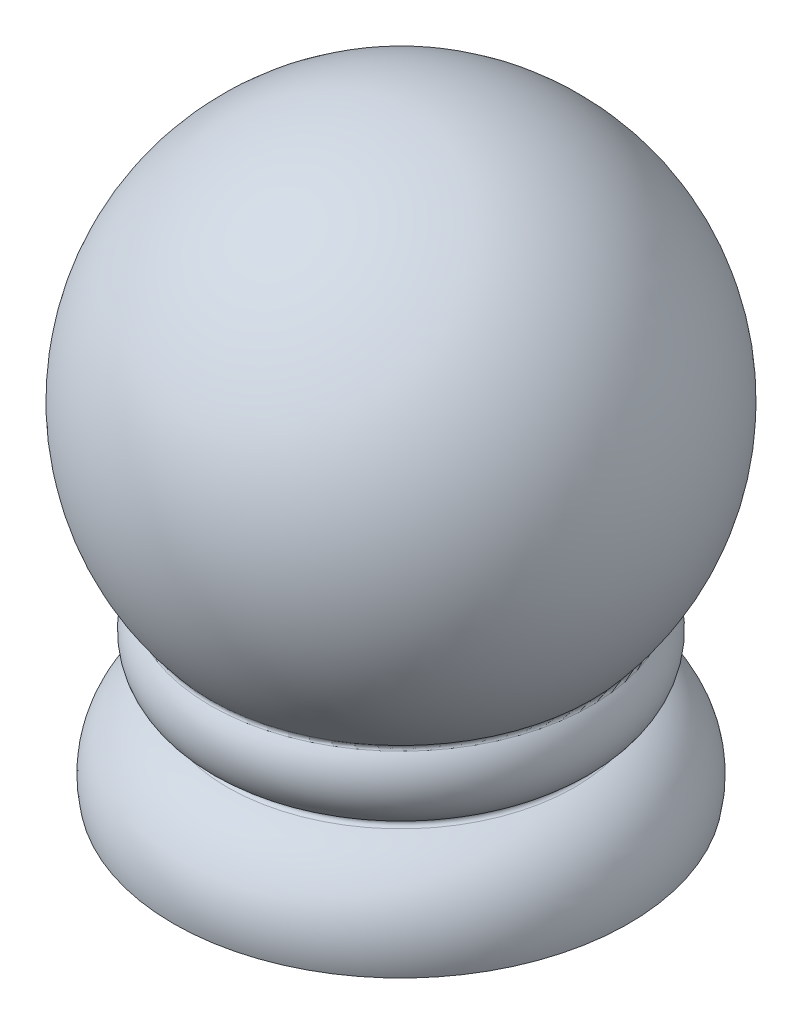
ISO-10303-21;
HEADER;
FILE_DESCRIPTION(('STEP AP214'),'2;1');
FILE_NAME('part.step','',(''),(''),'','','');
FILE_SCHEMA(('AUTOMOTIVE_DESIGN { 1 0 10303 214 1 1 1 1 }'));
ENDSEC;
DATA;
#1=APPLICATION_CONTEXT('core data for automotive mechanical design processes');
#2=APPLICATION_PROTOCOL_DEFINITION('international standard','automotive_design',2000,#1);
#3=PRODUCT_CONTEXT('',#1,'mechanical');
#4=PRODUCT('Part','Part','',(#3));
#5=PRODUCT_RELATED_PRODUCT_CATEGORY('part','',(#4));
#6=PRODUCT_DEFINITION_FORMATION('','',#4);
#7=PRODUCT_DEFINITION_CONTEXT('part definition',#1,'design');
#8=PRODUCT_DEFINITION('design','',#6,#7);
#9=PRODUCT_DEFINITION_SHAPE('','',#8);
#10=(LENGTH_UNIT() NAMED_UNIT(*) SI_UNIT(.MILLI.,.METRE.));
#11=(NAMED_UNIT(*) PLANE_ANGLE_UNIT() SI_UNIT($,.RADIAN.));
#12=(NAMED_UNIT(*) SI_UNIT($,.STERADIAN.) SOLID_ANGLE_UNIT());
#13=UNCERTAINTY_MEASURE_WITH_UNIT(LENGTH_MEASURE(1.E-05),#10,'distance_accuracy_value','');
#14=(GEOMETRIC_REPRESENTATION_CONTEXT(3) GLOBAL_UNCERTAINTY_ASSIGNED_CONTEXT((#13)) GLOBAL_UNIT_ASSIGNED_CONTEXT((#10,
#11,#12)) REPRESENTATION_CONTEXT('',''));
#15=CARTESIAN_POINT('',(0.,0.,0.));
#16=DIRECTION('',(0.,0.,1.));
#17=DIRECTION('',(1.,0.,0.));
#18=AXIS2_PLACEMENT_3D('',#15,#16,#17);
#19=CARTESIAN_POINT('',(0.,0.,0.));
#20=DIRECTION('',(0.,1.,0.));
#21=DIRECTION('',(0.,0.,1.));
#22=AXIS2_PLACEMENT_3D('',#19,#20,#21);
#23=PLANE('',#22);
#24=CARTESIAN_POINT('',(0.,0.,0.));
#25=DIRECTION('',(0.,1.,0.));
#26=DIRECTION('',(0.,0.,1.));
#27=AXIS2_PLACEMENT_3D('',#24,#25,#26);
#28=CIRCLE('',#27,13.5);
#29=CARTESIAN_POINT('',(0.,0.,13.5));
#30=VERTEX_POINT('',#29);
#31=EDGE_CURVE('E74',#30,#30,#28,.F.);
#32=ORIENTED_EDGE('',*,*,#31,.F.);
#33=EDGE_LOOP('',(#32));
#34=FACE_BOUND('',#33,.T.);
#35=CARTESIAN_POINT('',(0.,0.,0.));
#36=DIRECTION('',(0.,1.,0.));
#37=DIRECTION('',(0.,0.,1.));
#38=AXIS2_PLACEMENT_3D('',#35,#36,#37);
#39=CIRCLE('',#38,14.5);
#40=CARTESIAN_POINT('',(0.,0.,14.5));
#41=VERTEX_POINT('',#40);
#42=EDGE_CURVE('E73',#41,#41,#39,.T.);
#43=ORIENTED_EDGE('',*,*,#42,.F.);
#44=EDGE_LOOP('',(#43));
#45=FACE_BOUND('',#44,.T.);
#46=ADVANCED_FACE('F39',(#34,#45),#23,.F.);
#47=CARTESIAN_POINT('',(0.,1.01568651670156,0.));
#48=DIRECTION('',(0.,1.,0.));
#49=DIRECTION('',(0.,0.,1.));
#50=AXIS2_PLACEMENT_3D('',#47,#48,#49);
#51=TOROIDAL_SURFACE('',#50,9.60424868893541,5.);
#52=CARTESIAN_POINT('',(0.,5.79974780139765,0.));
#53=DIRECTION('',(0.,1.,0.));
#54=DIRECTION('',(0.,0.,1.));
#55=AXIS2_PLACEMENT_3D('',#52,#53,#54);
#56=CIRCLE('',#55,11.0577814970522);
#57=CARTESIAN_POINT('',(0.,5.79974780139765,11.0577814970522));
#58=VERTEX_POINT('',#57);
#59=EDGE_CURVE('E81',#58,#58,#56,.T.);
#60=ORIENTED_EDGE('',*,*,#59,.F.);
#61=EDGE_LOOP('',(#60));
#62=FACE_BOUND('',#61,.T.);
#63=ORIENTED_EDGE('',*,*,#42,.T.);
#64=EDGE_LOOP('',(#63));
#65=FACE_BOUND('',#64,.T.);
#66=ADVANCED_FACE('F136',(#62,#65),#51,.T.);
#67=CARTESIAN_POINT('',(0.,6.03895086563247,0.));
#68=DIRECTION('',(0.,1.,0.));
#69=DIRECTION('',(0.,0.,1.));
#70=AXIS2_PLACEMENT_3D('',#67,#68,#69);
#71=TOROIDAL_SURFACE('',#70,11.130458137458,0.250000000000001);
#72=ORIENTED_EDGE('',*,*,#59,.T.);
#73=EDGE_LOOP('',(#72));
#74=FACE_BOUND('',#73,.T.);
#75=CARTESIAN_POINT('',(0.,6.2660549286177,0.));
#76=DIRECTION('',(0.,1.,0.));
#77=DIRECTION('',(0.,0.,1.));
#78=AXIS2_PLACEMENT_3D('',#75,#76,#77);
#79=CIRCLE('',#78,11.0259414183381);
#80=CARTESIAN_POINT('',(0.,6.2660549286177,11.0259414183381));
#81=VERTEX_POINT('',#80);
#82=EDGE_CURVE('E90',#81,#81,#79,.T.);
#83=ORIENTED_EDGE('',*,*,#82,.F.);
#84=EDGE_LOOP('',(#83));
#85=FACE_BOUND('',#84,.T.);
#86=ADVANCED_FACE('F146',(#74,#85),#71,.F.);
#87=CARTESIAN_POINT('',(0.,8.99130368444052,0.));
#88=DIRECTION('',(0.,1.,0.));
#89=DIRECTION('',(0.,0.,1.));
#90=AXIS2_PLACEMENT_3D('',#87,#88,#89);
#91=TOROIDAL_SURFACE('',#90,9.7717407888987,3.);
#92=CARTESIAN_POINT('',(0.,10.8428470664505,0.));
#93=DIRECTION('',(0.,1.,0.));
#94=DIRECTION('',(0.,0.,1.));
#95=AXIS2_PLACEMENT_3D('',#92,#93,#94);
#96=CIRCLE('',#95,12.1322041130228);
#97=CARTESIAN_POINT('',(0.,10.8428470664505,12.1322041130228));
#98=VERTEX_POINT('',#97);
#99=EDGE_CURVE('E92',#98,#98,#96,.T.);
#100=ORIENTED_EDGE('',*,*,#99,.F.);
#101=EDGE_LOOP('',(#100));
#102=FACE_BOUND('',#101,.T.);
#103=ORIENTED_EDGE('',*,*,#82,.T.);
#104=EDGE_LOOP('',(#103));
#105=FACE_BOUND('',#104,.T.);
#106=ADVANCED_FACE('F192',(#102,#105),#91,.T.);
#107=CARTESIAN_POINT('',(0.,10.9971423482847,0.));
#108=DIRECTION('',(0.,1.,0.));
#109=DIRECTION('',(0.,0.,1.));
#110=AXIS2_PLACEMENT_3D('',#107,#108,#109);
#111=TOROIDAL_SURFACE('',#110,12.3289093900331,0.249999999999999);
#112=ORIENTED_EDGE('',*,*,#99,.T.);
#113=EDGE_LOOP('',(#112));
#114=FACE_BOUND('',#113,.T.);
#115=CARTESIAN_POINT('',(0.,11.1600017774535,0.));
#116=DIRECTION('',(0.,1.,0.));
#117=DIRECTION('',(0.,0.,1.));
#118=AXIS2_PLACEMENT_3D('',#115,#116,#117);
#119=CIRCLE('',#118,12.1392338609557);
#120=CARTESIAN_POINT('',(0.,11.1600017774535,12.1392338609557));
#121=VERTEX_POINT('',#120);
#122=EDGE_CURVE('E76',#121,#121,#119,.T.);
#123=ORIENTED_EDGE('',*,*,#122,.F.);
#124=EDGE_LOOP('',(#123));
#125=FACE_BOUND('',#124,.T.);
#126=ADVANCED_FACE('F193',(#114,#125),#111,.F.);
#127=CARTESIAN_POINT('',(0.,21.5830052442584,0.));
#128=DIRECTION('',(0.,1.,0.));
#129=DIRECTION('',(1.,0.,0.));
#130=AXIS2_PLACEMENT_3D('',#127,#128,#129);
#131=SPHERICAL_SURFACE('',#130,16.);
#132=ORIENTED_EDGE('',*,*,#122,.T.);
#133=EDGE_LOOP('',(#132));
#134=FACE_BOUND('',#133,.T.);
#135=ADVANCED_FACE('F189',(#134),#131,.T.);
#136=CARTESIAN_POINT('',(0.,39.3418180703654,0.));
#137=DIRECTION('',(0.,1.,0.));
#138=DIRECTION('',(0.,0.,1.));
#139=AXIS2_PLACEMENT_3D('',#136,#137,#138);
#140=CYLINDRICAL_SURFACE('',#139,13.5);
#141=CARTESIAN_POINT('',(0.,2.,0.));
#142=DIRECTION('',(0.,1.,0.));
#143=DIRECTION('',(0.,0.,1.));
#144=AXIS2_PLACEMENT_3D('',#141,#142,#143);
#145=CIRCLE('',#144,13.5);
#146=CARTESIAN_POINT('',(0.,2.,13.5));
#147=VERTEX_POINT('',#146);
#148=EDGE_CURVE('E79',#147,#147,#145,.T.);
#149=ORIENTED_EDGE('',*,*,#148,.T.);
#150=EDGE_LOOP('',(#149));
#151=FACE_BOUND('',#150,.T.);
#152=ORIENTED_EDGE('',*,*,#31,.T.);
#153=EDGE_LOOP('',(#152));
#154=FACE_BOUND('',#153,.T.);
#155=ADVANCED_FACE('F184',(#151,#154),#140,.F.);
#156=CARTESIAN_POINT('',(13.5,2.,0.));
#157=DIRECTION('',(0.,-1.,0.));
#158=DIRECTION('',(0.,0.,-1.));
#159=AXIS2_PLACEMENT_3D('',#156,#157,#158);
#160=PLANE('',#159);
#161=CARTESIAN_POINT('',(0.,2.,0.));
#162=DIRECTION('',(0.,-1.,0.));
#163=DIRECTION('',(0.,0.,-1.));
#164=AXIS2_PLACEMENT_3D('',#161,#162,#163);
#165=CIRCLE('',#164,12.6385619103768);
#166=CARTESIAN_POINT('',(0.,2.,-12.6385619103768));
#167=VERTEX_POINT('',#166);
#168=EDGE_CURVE('E69',#167,#167,#165,.F.);
#169=ORIENTED_EDGE('',*,*,#168,.T.);
#170=EDGE_LOOP('',(#169));
#171=FACE_BOUND('',#170,.T.);
#172=ORIENTED_EDGE('',*,*,#148,.F.);
#173=EDGE_LOOP('',(#172));
#174=FACE_BOUND('',#173,.T.);
#175=ADVANCED_FACE('F181',(#171,#174),#160,.T.);
#176=CARTESIAN_POINT('',(0.,2.,0.));
#177=DIRECTION('',(0.,-1.,0.));
#178=DIRECTION('',(0.,0.,-1.));
#179=AXIS2_PLACEMENT_3D('',#176,#177,#178);
#180=CONICAL_SURFACE('',#179,12.5,0.558599315343563);
#181=CARTESIAN_POINT('',(0.,2.1175002649992,0.));
#182=DIRECTION('',(0.,1.,0.));
#183=DIRECTION('',(0.,0.,1.));
#184=AXIS2_PLACEMENT_3D('',#181,#182,#183);
#185=CIRCLE('',#184,12.4265623343755);
#186=CARTESIAN_POINT('',(0.,2.1175002649992,12.4265623343755));
#187=VERTEX_POINT('',#186);
#188=EDGE_CURVE('E62',#187,#187,#185,.F.);
#189=ORIENTED_EDGE('',*,*,#188,.T.);
#190=EDGE_LOOP('',(#189));
#191=FACE_BOUND('',#190,.T.);
#192=CARTESIAN_POINT('',(0.,6.,0.));
#193=DIRECTION('',(0.,1.,0.));
#194=DIRECTION('',(0.,0.,1.));
#195=AXIS2_PLACEMENT_3D('',#192,#193,#194);
#196=CIRCLE('',#195,10.);
#197=CARTESIAN_POINT('',(0.,6.,10.));
#198=VERTEX_POINT('',#197);
#199=EDGE_CURVE('E103',#198,#198,#196,.T.);
#200=ORIENTED_EDGE('',*,*,#199,.T.);
#201=EDGE_LOOP('',(#200));
#202=FACE_BOUND('',#201,.T.);
#203=ADVANCED_FACE('F176',(#191,#202),#180,.F.);
#204=CARTESIAN_POINT('',(0.,39.3418180703654,0.));
#205=DIRECTION('',(0.,1.,0.));
#206=DIRECTION('',(0.,0.,1.));
#207=AXIS2_PLACEMENT_3D('',#204,#205,#206);
#208=CYLINDRICAL_SURFACE('',#207,10.);
#209=CARTESIAN_POINT('',(0.,28.,0.));
#210=DIRECTION('',(0.,-1.,0.));
#211=DIRECTION('',(0.,0.,-1.));
#212=AXIS2_PLACEMENT_3D('',#209,#210,#211);
#213=CIRCLE('',#212,10.);
#214=CARTESIAN_POINT('',(0.,28.,-10.));
#215=VERTEX_POINT('',#214);
#216=EDGE_CURVE('E50',#215,#215,#213,.F.);
#217=ORIENTED_EDGE('',*,*,#216,.T.);
#218=EDGE_LOOP('',(#217));
#219=FACE_BOUND('',#218,.T.);
#220=ORIENTED_EDGE('',*,*,#199,.F.);
#221=EDGE_LOOP('',(#220));
#222=FACE_BOUND('',#221,.T.);
#223=ADVANCED_FACE('F175',(#219,#222),#208,.F.);
#224=CARTESIAN_POINT('',(10.,30.,0.));
#225=DIRECTION('',(0.,-1.,0.));
#226=DIRECTION('',(0.,0.,-1.));
#227=AXIS2_PLACEMENT_3D('',#224,#225,#226);
#228=PLANE('',#227);
#229=CARTESIAN_POINT('',(0.,30.,0.));
#230=DIRECTION('',(0.,-1.,0.));
#231=DIRECTION('',(0.,0.,-1.));
#232=AXIS2_PLACEMENT_3D('',#229,#230,#231);
#233=CIRCLE('',#232,8.);
#234=CARTESIAN_POINT('',(0.,30.,-8.));
#235=VERTEX_POINT('',#234);
#236=EDGE_CURVE('E10',#235,#235,#233,.T.);
#237=ORIENTED_EDGE('',*,*,#236,.T.);
#238=EDGE_LOOP('',(#237));
#239=FACE_BOUND('',#238,.T.);
#240=CARTESIAN_POINT('',(0.,30.,0.));
#241=DIRECTION('',(0.,-1.,0.));
#242=DIRECTION('',(0.,0.,-1.));
#243=AXIS2_PLACEMENT_3D('',#240,#241,#242);
#244=CIRCLE('',#243,4.5);
#245=CARTESIAN_POINT('',(0.,30.,-4.5));
#246=VERTEX_POINT('',#245);
#247=EDGE_CURVE('E102',#246,#246,#244,.T.);
#248=ORIENTED_EDGE('',*,*,#247,.F.);
#249=EDGE_LOOP('',(#248));
#250=FACE_BOUND('',#249,.T.);
#251=ADVANCED_FACE('F137',(#239,#250),#228,.T.);
#252=CARTESIAN_POINT('',(0.,30.,0.));
#253=DIRECTION('',(0.,1.,0.));
#254=DIRECTION('',(0.,0.,-1.));
#255=AXIS2_PLACEMENT_3D('',#252,#253,#254);
#256=CONICAL_SURFACE('',#255,4.5,0.0174532925199433);
#257=CARTESIAN_POINT('',(0.,24.2456368983907,0.));
#258=DIRECTION('',(0.,1.,0.));
#259=DIRECTION('',(0.,0.,1.));
#260=AXIS2_PLACEMENT_3D('',#257,#258,#259);
#261=CIRCLE('',#260,4.39955721844087);
#262=CARTESIAN_POINT('',(0.,24.2456368983907,4.39955721844087));
#263=VERTEX_POINT('',#262);
#264=EDGE_CURVE('E53',#263,#263,#261,.T.);
#265=ORIENTED_EDGE('',*,*,#264,.T.);
#266=EDGE_LOOP('',(#265));
#267=FACE_BOUND('',#266,.T.);
#268=ORIENTED_EDGE('',*,*,#247,.T.);
#269=EDGE_LOOP('',(#268));
#270=FACE_BOUND('',#269,.T.);
#271=ADVANCED_FACE('F129',(#267,#270),#256,.T.);
#272=CARTESIAN_POINT('',(0.,24.,0.));
#273=DIRECTION('',(0.,-1.,0.));
#274=DIRECTION('',(0.,0.,-1.));
#275=AXIS2_PLACEMENT_3D('',#272,#273,#274);
#276=PLANE('',#275);
#277=CARTESIAN_POINT('',(0.,24.,0.));
#278=DIRECTION('',(0.,-1.,0.));
#279=DIRECTION('',(0.,0.,-1.));
#280=AXIS2_PLACEMENT_3D('',#277,#278,#279);
#281=CIRCLE('',#280,4.14959529465177);
#282=CARTESIAN_POINT('',(0.,24.,-4.14959529465177));
#283=VERTEX_POINT('',#282);
#284=EDGE_CURVE('E58',#283,#283,#281,.T.);
#285=ORIENTED_EDGE('',*,*,#284,.T.);
#286=EDGE_LOOP('',(#285));
#287=FACE_BOUND('',#286,.T.);
#288=CARTESIAN_POINT('',(0.,24.,0.));
#289=DIRECTION('',(0.,-1.,0.));
#290=DIRECTION('',(0.,0.,-1.));
#291=AXIS2_PLACEMENT_3D('',#288,#289,#290);
#292=CIRCLE('',#291,3.25);
#293=CARTESIAN_POINT('',(0.,24.,-3.25));
#294=VERTEX_POINT('',#293);
#295=EDGE_CURVE('E109',#294,#294,#292,.T.);
#296=ORIENTED_EDGE('',*,*,#295,.F.);
#297=EDGE_LOOP('',(#296));
#298=FACE_BOUND('',#297,.T.);
#299=ADVANCED_FACE('F121',(#287,#298),#276,.T.);
#300=CARTESIAN_POINT('',(0.,34.,0.));
#301=DIRECTION('',(0.,-1.,0.));
#302=DIRECTION('',(0.,0.,-1.));
#303=AXIS2_PLACEMENT_3D('',#300,#301,#302);
#304=CYLINDRICAL_SURFACE('',#303,3.25);
#305=CARTESIAN_POINT('',(0.,34.,0.));
#306=DIRECTION('',(0.,-1.,0.));
#307=DIRECTION('',(0.,0.,-1.));
#308=AXIS2_PLACEMENT_3D('',#305,#306,#307);
#309=CIRCLE('',#308,3.25);
#310=CARTESIAN_POINT('',(0.,34.,-3.25));
#311=VERTEX_POINT('',#310);
#312=EDGE_CURVE('E107',#311,#311,#309,.T.);
#313=ORIENTED_EDGE('',*,*,#312,.F.);
#314=EDGE_LOOP('',(#313));
#315=FACE_BOUND('',#314,.T.);
#316=ORIENTED_EDGE('',*,*,#295,.T.);
#317=EDGE_LOOP('',(#316));
#318=FACE_BOUND('',#317,.T.);
#319=ADVANCED_FACE('F122',(#315,#318),#304,.F.);
#320=CARTESIAN_POINT('',(0.,34.,0.));
#321=DIRECTION('',(0.,-1.,0.));
#322=DIRECTION('',(0.,0.,-1.));
#323=AXIS2_PLACEMENT_3D('',#320,#321,#322);
#324=PLANE('',#323);
#325=ORIENTED_EDGE('',*,*,#312,.T.);
#326=EDGE_LOOP('',(#325));
#327=FACE_BOUND('',#326,.T.);
#328=ADVANCED_FACE('F118',(#327),#324,.T.);
#329=CARTESIAN_POINT('',(0.,2.25,0.));
#330=DIRECTION('',(0.,-1.,0.));
#331=DIRECTION('',(0.,0.,-1.));
#332=AXIS2_PLACEMENT_3D('',#329,#330,#331);
#333=TOROIDAL_SURFACE('',#332,12.6385619103768,0.25);
#334=ORIENTED_EDGE('',*,*,#188,.F.);
#335=EDGE_LOOP('',(#334));
#336=FACE_BOUND('',#335,.T.);
#337=ORIENTED_EDGE('',*,*,#168,.F.);
#338=EDGE_LOOP('',(#337));
#339=FACE_BOUND('',#338,.T.);
#340=ADVANCED_FACE('F151',(#336,#339),#333,.T.);
#341=CARTESIAN_POINT('',(0.,24.25,0.));
#342=DIRECTION('',(0.,-1.,0.));
#343=DIRECTION('',(0.,0.,-1.));
#344=AXIS2_PLACEMENT_3D('',#341,#342,#343);
#345=TOROIDAL_SURFACE('',#344,4.14959529465177,0.25);
#346=ORIENTED_EDGE('',*,*,#264,.F.);
#347=EDGE_LOOP('',(#346));
#348=FACE_BOUND('',#347,.T.);
#349=ORIENTED_EDGE('',*,*,#284,.F.);
#350=EDGE_LOOP('',(#349));
#351=FACE_BOUND('',#350,.T.);
#352=ADVANCED_FACE('F157',(#348,#351),#345,.T.);
#353=CARTESIAN_POINT('',(0.,28.,0.));
#354=DIRECTION('',(0.,-1.,0.));
#355=DIRECTION('',(0.,0.,-1.));
#356=AXIS2_PLACEMENT_3D('',#353,#354,#355);
#357=TOROIDAL_SURFACE('',#356,8.,2.);
#358=ORIENTED_EDGE('',*,*,#236,.F.);
#359=EDGE_LOOP('',(#358));
#360=FACE_BOUND('',#359,.T.);
#361=ORIENTED_EDGE('',*,*,#216,.F.);
#362=EDGE_LOOP('',(#361));
#363=FACE_BOUND('',#362,.T.);
#364=ADVANCED_FACE('F41',(#360,#363),#357,.F.);
#365=CLOSED_SHELL('',(#46,#66,#86,#106,#126,#135,#155,#175,#203,#223,#251,#271,#299,#319,#328,
#340,#352,#364));
#366=MANIFOLD_SOLID_BREP('B2',#365);
#367=ADVANCED_BREP_SHAPE_REPRESENTATION('',(#18,#366),#14);
#368=SHAPE_DEFINITION_REPRESENTATION(#9,#367);
ENDSEC;
END-ISO-10303-21;
